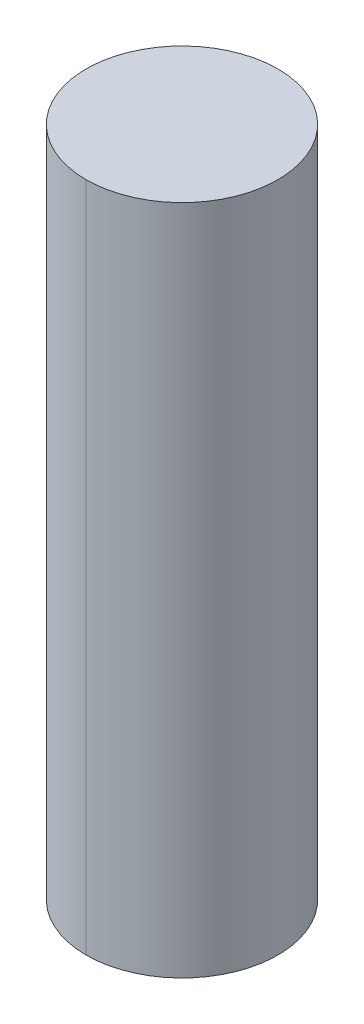
ISO-10303-21;
HEADER;
FILE_DESCRIPTION(('STEP AP214'),'2;1');
FILE_NAME('part.step','',(''),(''),'','','');
FILE_SCHEMA(('AUTOMOTIVE_DESIGN { 1 0 10303 214 1 1 1 1 }'));
ENDSEC;
DATA;
#1=APPLICATION_CONTEXT('core data for automotive mechanical design processes');
#2=APPLICATION_PROTOCOL_DEFINITION('international standard','automotive_design',2000,#1);
#3=PRODUCT_CONTEXT('',#1,'mechanical');
#4=PRODUCT('Part','Part','',(#3));
#5=PRODUCT_RELATED_PRODUCT_CATEGORY('part','',(#4));
#6=PRODUCT_DEFINITION_FORMATION('','',#4);
#7=PRODUCT_DEFINITION_CONTEXT('part definition',#1,'design');
#8=PRODUCT_DEFINITION('design','',#6,#7);
#9=PRODUCT_DEFINITION_SHAPE('','',#8);
#10=(LENGTH_UNIT() NAMED_UNIT(*) SI_UNIT(.MILLI.,.METRE.));
#11=(NAMED_UNIT(*) PLANE_ANGLE_UNIT() SI_UNIT($,.RADIAN.));
#12=(NAMED_UNIT(*) SI_UNIT($,.STERADIAN.) SOLID_ANGLE_UNIT());
#13=UNCERTAINTY_MEASURE_WITH_UNIT(LENGTH_MEASURE(1.E-05),#10,'distance_accuracy_value','');
#14=(GEOMETRIC_REPRESENTATION_CONTEXT(3) GLOBAL_UNCERTAINTY_ASSIGNED_CONTEXT((#13)) GLOBAL_UNIT_ASSIGNED_CONTEXT((#10,
#11,#12)) REPRESENTATION_CONTEXT('',''));
#15=CARTESIAN_POINT('',(0.,0.,0.));
#16=DIRECTION('',(0.,0.,1.));
#17=DIRECTION('',(1.,0.,0.));
#18=AXIS2_PLACEMENT_3D('',#15,#16,#17);
#19=CARTESIAN_POINT('',(0.,66.5,0.));
#20=DIRECTION('',(0.,-1.,0.));
#21=DIRECTION('',(0.,0.,-1.));
#22=AXIS2_PLACEMENT_3D('',#19,#20,#21);
#23=PLANE('',#22);
#24=CARTESIAN_POINT('',(0.,66.5,0.));
#25=DIRECTION('',(0.,-1.,0.));
#26=DIRECTION('',(0.,0.,-1.));
#27=AXIS2_PLACEMENT_3D('',#24,#25,#26);
#28=CIRCLE('',#27,2.);
#29=CARTESIAN_POINT('',(0.,66.5,2.));
#30=VERTEX_POINT('',#29);
#31=CARTESIAN_POINT('',(0.,66.5,-2.));
#32=VERTEX_POINT('',#31);
#33=EDGE_CURVE('E11',#30,#32,#28,.T.);
#34=ORIENTED_EDGE('',*,*,#33,.F.);
#35=CARTESIAN_POINT('',(0.,66.5,0.));
#36=DIRECTION('',(0.,-1.,0.));
#37=DIRECTION('',(0.,0.,-1.));
#38=AXIS2_PLACEMENT_3D('',#35,#36,#37);
#39=CIRCLE('',#38,2.);
#40=EDGE_CURVE('E25',#32,#30,#39,.T.);
#41=ORIENTED_EDGE('',*,*,#40,.F.);
#42=EDGE_LOOP('',(#34,#41));
#43=FACE_BOUND('',#42,.T.);
#44=ADVANCED_FACE('F17',(#43),#23,.F.);
#45=CARTESIAN_POINT('',(0.,52.5,0.));
#46=DIRECTION('',(0.,-1.,0.));
#47=DIRECTION('',(-1.,0.,0.));
#48=AXIS2_PLACEMENT_3D('',#45,#46,#47);
#49=CYLINDRICAL_SURFACE('',#48,2.);
#50=DIRECTION('',(0.,-1.,0.));
#51=VECTOR('',#50,1.);
#52=CARTESIAN_POINT('',(0.,66.5,2.));
#53=LINE('',#52,#51);
#54=CARTESIAN_POINT('',(0.,52.5,2.));
#55=VERTEX_POINT('',#54);
#56=EDGE_CURVE('E45',#30,#55,#53,.T.);
#57=ORIENTED_EDGE('',*,*,#56,.T.);
#58=CARTESIAN_POINT('',(0.,52.5,0.));
#59=DIRECTION('',(0.,-1.,0.));
#60=DIRECTION('',(0.,0.,-1.));
#61=AXIS2_PLACEMENT_3D('',#58,#59,#60);
#62=CIRCLE('',#61,2.);
#63=CARTESIAN_POINT('',(0.,52.5,-2.));
#64=VERTEX_POINT('',#63);
#65=EDGE_CURVE('E41',#64,#55,#62,.T.);
#66=ORIENTED_EDGE('',*,*,#65,.F.);
#67=DIRECTION('',(0.,-1.,0.));
#68=VECTOR('',#67,1.);
#69=CARTESIAN_POINT('',(0.,66.5,-2.));
#70=LINE('',#69,#68);
#71=EDGE_CURVE('E44',#32,#64,#70,.T.);
#72=ORIENTED_EDGE('',*,*,#71,.F.);
#73=ORIENTED_EDGE('',*,*,#40,.T.);
#74=EDGE_LOOP('',(#57,#66,#72,#73));
#75=FACE_BOUND('',#74,.T.);
#76=ADVANCED_FACE('F43',(#75),#49,.T.);
#77=CARTESIAN_POINT('',(0.,52.5,0.));
#78=DIRECTION('',(0.,-1.,0.));
#79=DIRECTION('',(1.,0.,0.));
#80=AXIS2_PLACEMENT_3D('',#77,#78,#79);
#81=CYLINDRICAL_SURFACE('',#80,2.);
#82=ORIENTED_EDGE('',*,*,#56,.F.);
#83=ORIENTED_EDGE('',*,*,#33,.T.);
#84=ORIENTED_EDGE('',*,*,#71,.T.);
#85=CARTESIAN_POINT('',(0.,52.5,0.));
#86=DIRECTION('',(0.,-1.,0.));
#87=DIRECTION('',(0.,0.,-1.));
#88=AXIS2_PLACEMENT_3D('',#85,#86,#87);
#89=CIRCLE('',#88,2.);
#90=EDGE_CURVE('E52',#55,#64,#89,.T.);
#91=ORIENTED_EDGE('',*,*,#90,.F.);
#92=EDGE_LOOP('',(#82,#83,#84,#91));
#93=FACE_BOUND('',#92,.T.);
#94=ADVANCED_FACE('F51',(#93),#81,.T.);
#95=CARTESIAN_POINT('',(0.,52.5,-2.));
#96=DIRECTION('',(0.,1.,0.));
#97=DIRECTION('',(0.,0.,1.));
#98=AXIS2_PLACEMENT_3D('',#95,#96,#97);
#99=PLANE('',#98);
#100=ORIENTED_EDGE('',*,*,#65,.T.);
#101=ORIENTED_EDGE('',*,*,#90,.T.);
#102=EDGE_LOOP('',(#100,#101));
#103=FACE_BOUND('',#102,.T.);
#104=ADVANCED_FACE('F54',(#103),#99,.F.);
#105=CLOSED_SHELL('',(#44,#76,#94,#104));
#106=MANIFOLD_SOLID_BREP('B1',#105);
#107=ADVANCED_BREP_SHAPE_REPRESENTATION('',(#18,#106),#14);
#108=SHAPE_DEFINITION_REPRESENTATION(#9,#107);
ENDSEC;
END-ISO-10303-21;
